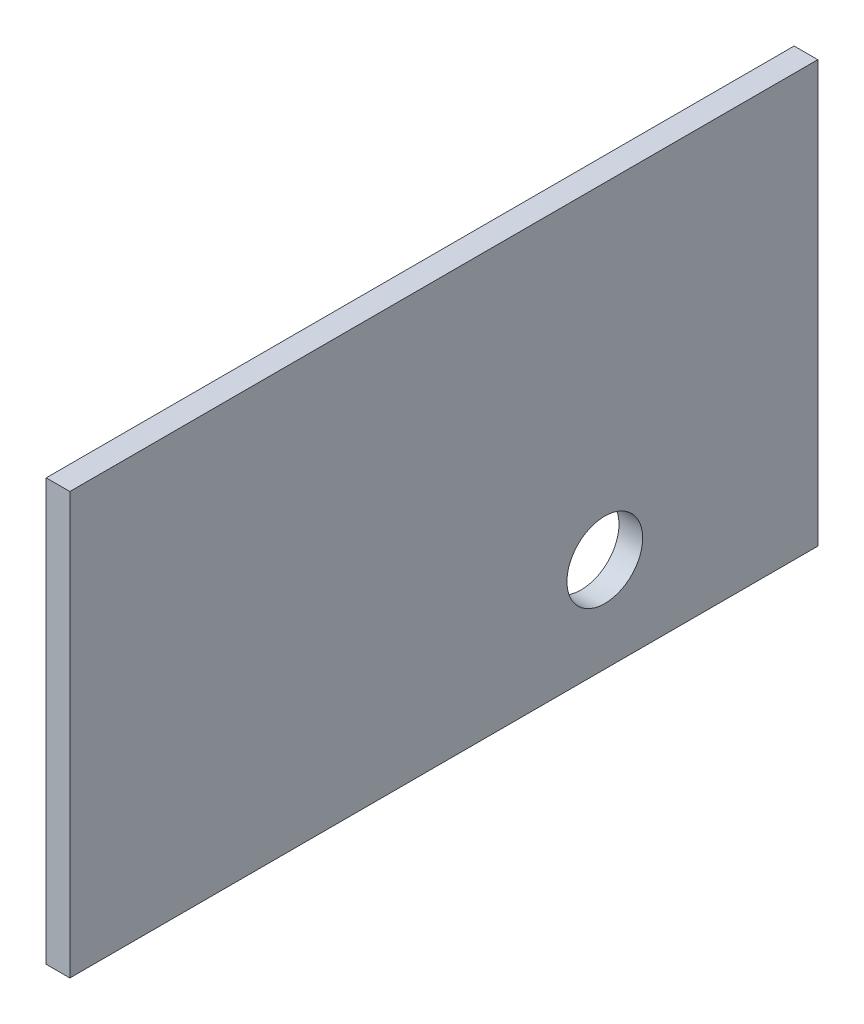
ISO-10303-21;
HEADER;
FILE_DESCRIPTION(('STEP AP214'),'2;1');
FILE_NAME('part.step','',(''),(''),'','','');
FILE_SCHEMA(('AUTOMOTIVE_DESIGN { 1 0 10303 214 1 1 1 1 }'));
ENDSEC;
DATA;
#1=APPLICATION_CONTEXT('core data for automotive mechanical design processes');
#2=APPLICATION_PROTOCOL_DEFINITION('international standard','automotive_design',2000,#1);
#3=PRODUCT_CONTEXT('',#1,'mechanical');
#4=PRODUCT('Part','Part','',(#3));
#5=PRODUCT_RELATED_PRODUCT_CATEGORY('part','',(#4));
#6=PRODUCT_DEFINITION_FORMATION('','',#4);
#7=PRODUCT_DEFINITION_CONTEXT('part definition',#1,'design');
#8=PRODUCT_DEFINITION('design','',#6,#7);
#9=PRODUCT_DEFINITION_SHAPE('','',#8);
#10=(LENGTH_UNIT() NAMED_UNIT(*) SI_UNIT(.MILLI.,.METRE.));
#11=(NAMED_UNIT(*) PLANE_ANGLE_UNIT() SI_UNIT($,.RADIAN.));
#12=(NAMED_UNIT(*) SI_UNIT($,.STERADIAN.) SOLID_ANGLE_UNIT());
#13=UNCERTAINTY_MEASURE_WITH_UNIT(LENGTH_MEASURE(1.E-05),#10,'distance_accuracy_value','');
#14=(GEOMETRIC_REPRESENTATION_CONTEXT(3) GLOBAL_UNCERTAINTY_ASSIGNED_CONTEXT((#13)) GLOBAL_UNIT_ASSIGNED_CONTEXT((#10,
#11,#12)) REPRESENTATION_CONTEXT('',''));
#15=CARTESIAN_POINT('',(0.,0.,0.));
#16=DIRECTION('',(0.,0.,1.));
#17=DIRECTION('',(1.,0.,0.));
#18=AXIS2_PLACEMENT_3D('',#15,#16,#17);
#19=CARTESIAN_POINT('',(5.,0.,0.));
#20=DIRECTION('',(0.,0.,-1.));
#21=DIRECTION('',(0.,1.,0.));
#22=AXIS2_PLACEMENT_3D('',#19,#20,#21);
#23=PLANE('',#22);
#24=DIRECTION('',(0.,-1.,0.));
#25=VECTOR('',#24,1.);
#26=CARTESIAN_POINT('',(0.,0.,0.));
#27=LINE('',#26,#25);
#28=CARTESIAN_POINT('',(0.,0.,0.));
#29=VERTEX_POINT('',#28);
#30=CARTESIAN_POINT('',(0.,-89.,0.));
#31=VERTEX_POINT('',#30);
#32=EDGE_CURVE('E100',#29,#31,#27,.T.);
#33=ORIENTED_EDGE('',*,*,#32,.T.);
#34=DIRECTION('',(-1.,0.,0.));
#35=VECTOR('',#34,1.);
#36=CARTESIAN_POINT('',(5.,-89.,0.));
#37=LINE('',#36,#35);
#38=CARTESIAN_POINT('',(5.,-89.,0.));
#39=VERTEX_POINT('',#38);
#40=EDGE_CURVE('E11',#39,#31,#37,.T.);
#41=ORIENTED_EDGE('',*,*,#40,.F.);
#42=DIRECTION('',(0.,-1.,0.));
#43=VECTOR('',#42,1.);
#44=CARTESIAN_POINT('',(5.,0.,0.));
#45=LINE('',#44,#43);
#46=CARTESIAN_POINT('',(5.,0.,0.));
#47=VERTEX_POINT('',#46);
#48=EDGE_CURVE('E88',#47,#39,#45,.T.);
#49=ORIENTED_EDGE('',*,*,#48,.F.);
#50=DIRECTION('',(-1.,0.,0.));
#51=VECTOR('',#50,1.);
#52=CARTESIAN_POINT('',(5.,0.,0.));
#53=LINE('',#52,#51);
#54=EDGE_CURVE('E96',#47,#29,#53,.T.);
#55=ORIENTED_EDGE('',*,*,#54,.T.);
#56=EDGE_LOOP('',(#33,#41,#49,#55));
#57=FACE_BOUND('',#56,.T.);
#58=ADVANCED_FACE('F37',(#57),#23,.F.);
#59=CARTESIAN_POINT('',(5.,-89.,0.));
#60=DIRECTION('',(0.,1.,0.));
#61=DIRECTION('',(0.,0.,1.));
#62=AXIS2_PLACEMENT_3D('',#59,#60,#61);
#63=PLANE('',#62);
#64=DIRECTION('',(0.,0.,-1.));
#65=VECTOR('',#64,1.);
#66=CARTESIAN_POINT('',(0.,-89.,0.));
#67=LINE('',#66,#65);
#68=CARTESIAN_POINT('',(0.,-89.,-158.));
#69=VERTEX_POINT('',#68);
#70=EDGE_CURVE('E92',#31,#69,#67,.T.);
#71=ORIENTED_EDGE('',*,*,#70,.T.);
#72=DIRECTION('',(-1.,0.,0.));
#73=VECTOR('',#72,1.);
#74=CARTESIAN_POINT('',(5.,-89.,-158.));
#75=LINE('',#74,#73);
#76=CARTESIAN_POINT('',(5.,-89.,-158.));
#77=VERTEX_POINT('',#76);
#78=EDGE_CURVE('E45',#77,#69,#75,.T.);
#79=ORIENTED_EDGE('',*,*,#78,.F.);
#80=DIRECTION('',(0.,0.,-1.));
#81=VECTOR('',#80,1.);
#82=CARTESIAN_POINT('',(5.,-89.,0.));
#83=LINE('',#82,#81);
#84=EDGE_CURVE('E83',#39,#77,#83,.T.);
#85=ORIENTED_EDGE('',*,*,#84,.F.);
#86=ORIENTED_EDGE('',*,*,#40,.T.);
#87=EDGE_LOOP('',(#71,#79,#85,#86));
#88=FACE_BOUND('',#87,.T.);
#89=ADVANCED_FACE('F91',(#88),#63,.F.);
#90=CARTESIAN_POINT('',(5.,0.,-158.));
#91=DIRECTION('',(0.,0.,1.));
#92=DIRECTION('',(1.,0.,0.));
#93=AXIS2_PLACEMENT_3D('',#90,#91,#92);
#94=PLANE('',#93);
#95=DIRECTION('',(0.,1.,0.));
#96=VECTOR('',#95,1.);
#97=CARTESIAN_POINT('',(0.,0.,-158.));
#98=LINE('',#97,#96);
#99=CARTESIAN_POINT('',(0.,0.,-158.));
#100=VERTEX_POINT('',#99);
#101=EDGE_CURVE('E70',#69,#100,#98,.T.);
#102=ORIENTED_EDGE('',*,*,#101,.T.);
#103=DIRECTION('',(-1.,0.,0.));
#104=VECTOR('',#103,1.);
#105=CARTESIAN_POINT('',(5.,0.,-158.));
#106=LINE('',#105,#104);
#107=CARTESIAN_POINT('',(5.,0.,-158.));
#108=VERTEX_POINT('',#107);
#109=EDGE_CURVE('E93',#108,#100,#106,.T.);
#110=ORIENTED_EDGE('',*,*,#109,.F.);
#111=DIRECTION('',(0.,1.,0.));
#112=VECTOR('',#111,1.);
#113=CARTESIAN_POINT('',(5.,0.,-158.));
#114=LINE('',#113,#112);
#115=EDGE_CURVE('E86',#77,#108,#114,.T.);
#116=ORIENTED_EDGE('',*,*,#115,.F.);
#117=ORIENTED_EDGE('',*,*,#78,.T.);
#118=EDGE_LOOP('',(#102,#110,#116,#117));
#119=FACE_BOUND('',#118,.T.);
#120=ADVANCED_FACE('F94',(#119),#94,.F.);
#121=CARTESIAN_POINT('',(5.,0.,0.));
#122=DIRECTION('',(0.,-1.,0.));
#123=DIRECTION('',(0.,0.,-1.));
#124=AXIS2_PLACEMENT_3D('',#121,#122,#123);
#125=PLANE('',#124);
#126=DIRECTION('',(0.,0.,1.));
#127=VECTOR('',#126,1.);
#128=CARTESIAN_POINT('',(0.,0.,0.));
#129=LINE('',#128,#127);
#130=EDGE_CURVE('E76',#100,#29,#129,.T.);
#131=ORIENTED_EDGE('',*,*,#130,.T.);
#132=ORIENTED_EDGE('',*,*,#54,.F.);
#133=DIRECTION('',(0.,0.,1.));
#134=VECTOR('',#133,1.);
#135=CARTESIAN_POINT('',(5.,0.,0.));
#136=LINE('',#135,#134);
#137=EDGE_CURVE('E53',#108,#47,#136,.T.);
#138=ORIENTED_EDGE('',*,*,#137,.F.);
#139=ORIENTED_EDGE('',*,*,#109,.T.);
#140=EDGE_LOOP('',(#131,#132,#138,#139));
#141=FACE_BOUND('',#140,.T.);
#142=ADVANCED_FACE('F108',(#141),#125,.F.);
#143=CARTESIAN_POINT('',(5.,0.,0.));
#144=DIRECTION('',(1.,0.,0.));
#145=DIRECTION('',(0.,0.,-1.));
#146=AXIS2_PLACEMENT_3D('',#143,#144,#145);
#147=PLANE('',#146);
#148=CARTESIAN_POINT('',(5.,-69.,-113.));
#149=DIRECTION('',(1.,0.,0.));
#150=DIRECTION('',(0.,0.,-1.));
#151=AXIS2_PLACEMENT_3D('',#148,#149,#150);
#152=CIRCLE('',#151,8.00000000000001);
#153=CARTESIAN_POINT('',(5.,-69.,-121.));
#154=VERTEX_POINT('',#153);
#155=EDGE_CURVE('E114',#154,#154,#152,.T.);
#156=ORIENTED_EDGE('',*,*,#155,.F.);
#157=EDGE_LOOP('',(#156));
#158=FACE_BOUND('',#157,.T.);
#159=ORIENTED_EDGE('',*,*,#48,.T.);
#160=ORIENTED_EDGE('',*,*,#84,.T.);
#161=ORIENTED_EDGE('',*,*,#115,.T.);
#162=ORIENTED_EDGE('',*,*,#137,.T.);
#163=EDGE_LOOP('',(#159,#160,#161,#162));
#164=FACE_BOUND('',#163,.T.);
#165=ADVANCED_FACE('F84',(#158,#164),#147,.T.);
#166=CARTESIAN_POINT('',(0.,0.,0.));
#167=DIRECTION('',(1.,0.,0.));
#168=DIRECTION('',(0.,0.,-1.));
#169=AXIS2_PLACEMENT_3D('',#166,#167,#168);
#170=PLANE('',#169);
#171=CARTESIAN_POINT('',(0.,-69.,-113.));
#172=DIRECTION('',(1.,0.,0.));
#173=DIRECTION('',(0.,0.,-1.));
#174=AXIS2_PLACEMENT_3D('',#171,#172,#173);
#175=CIRCLE('',#174,8.00000000000001);
#176=CARTESIAN_POINT('',(0.,-69.,-121.));
#177=VERTEX_POINT('',#176);
#178=EDGE_CURVE('E103',#177,#177,#175,.T.);
#179=ORIENTED_EDGE('',*,*,#178,.T.);
#180=EDGE_LOOP('',(#179));
#181=FACE_BOUND('',#180,.T.);
#182=ORIENTED_EDGE('',*,*,#32,.F.);
#183=ORIENTED_EDGE('',*,*,#130,.F.);
#184=ORIENTED_EDGE('',*,*,#101,.F.);
#185=ORIENTED_EDGE('',*,*,#70,.F.);
#186=EDGE_LOOP('',(#182,#183,#184,#185));
#187=FACE_BOUND('',#186,.T.);
#188=ADVANCED_FACE('F111',(#181,#187),#170,.F.);
#189=CARTESIAN_POINT('',(0.,-69.,-113.));
#190=DIRECTION('',(1.,0.,0.));
#191=DIRECTION('',(0.,0.,-1.));
#192=AXIS2_PLACEMENT_3D('',#189,#190,#191);
#193=CYLINDRICAL_SURFACE('',#192,8.00000000000001);
#194=ORIENTED_EDGE('',*,*,#178,.F.);
#195=EDGE_LOOP('',(#194));
#196=FACE_BOUND('',#195,.T.);
#197=ORIENTED_EDGE('',*,*,#155,.T.);
#198=EDGE_LOOP('',(#197));
#199=FACE_BOUND('',#198,.T.);
#200=ADVANCED_FACE('F121',(#196,#199),#193,.F.);
#201=CLOSED_SHELL('',(#58,#89,#120,#142,#165,#188,#200));
#202=MANIFOLD_SOLID_BREP('B2',#201);
#203=ADVANCED_BREP_SHAPE_REPRESENTATION('',(#18,#202),#14);
#204=SHAPE_DEFINITION_REPRESENTATION(#9,#203);
ENDSEC;
END-ISO-10303-21;
